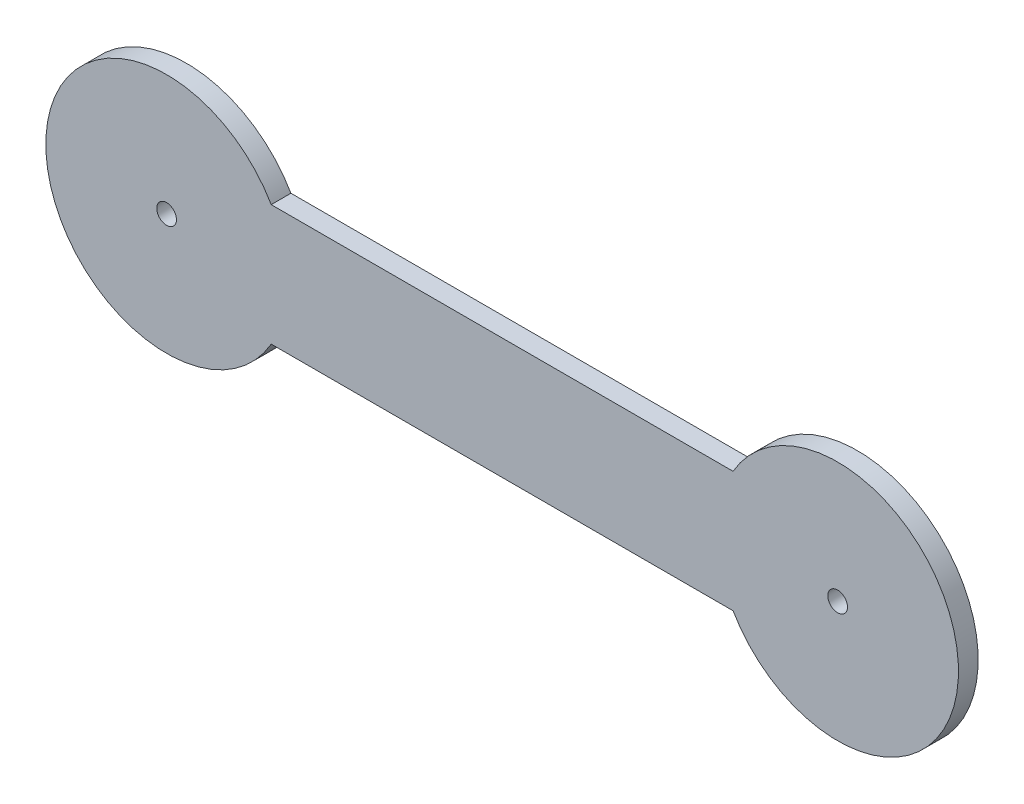
ISO-10303-21;
HEADER;
FILE_DESCRIPTION(('STEP AP214'),'2;1');
FILE_NAME('part.step','',(''),(''),'','','');
FILE_SCHEMA(('AUTOMOTIVE_DESIGN { 1 0 10303 214 1 1 1 1 }'));
ENDSEC;
DATA;
#1=APPLICATION_CONTEXT('core data for automotive mechanical design processes');
#2=APPLICATION_PROTOCOL_DEFINITION('international standard','automotive_design',2000,#1);
#3=PRODUCT_CONTEXT('',#1,'mechanical');
#4=PRODUCT('Part','Part','',(#3));
#5=PRODUCT_RELATED_PRODUCT_CATEGORY('part','',(#4));
#6=PRODUCT_DEFINITION_FORMATION('','',#4);
#7=PRODUCT_DEFINITION_CONTEXT('part definition',#1,'design');
#8=PRODUCT_DEFINITION('design','',#6,#7);
#9=PRODUCT_DEFINITION_SHAPE('','',#8);
#10=(LENGTH_UNIT() NAMED_UNIT(*) SI_UNIT(.MILLI.,.METRE.));
#11=(NAMED_UNIT(*) PLANE_ANGLE_UNIT() SI_UNIT($,.RADIAN.));
#12=(NAMED_UNIT(*) SI_UNIT($,.STERADIAN.) SOLID_ANGLE_UNIT());
#13=UNCERTAINTY_MEASURE_WITH_UNIT(LENGTH_MEASURE(1.E-05),#10,'distance_accuracy_value','');
#14=(GEOMETRIC_REPRESENTATION_CONTEXT(3) GLOBAL_UNCERTAINTY_ASSIGNED_CONTEXT((#13)) GLOBAL_UNIT_ASSIGNED_CONTEXT((#10,
#11,#12)) REPRESENTATION_CONTEXT('',''));
#15=CARTESIAN_POINT('',(0.,0.,0.));
#16=DIRECTION('',(0.,0.,1.));
#17=DIRECTION('',(1.,0.,0.));
#18=AXIS2_PLACEMENT_3D('',#15,#16,#17);
#19=CARTESIAN_POINT('',(0.,19.05,6.223));
#20=DIRECTION('',(0.,0.,-1.));
#21=DIRECTION('',(-1.,0.,0.));
#22=AXIS2_PLACEMENT_3D('',#19,#20,#21);
#23=CYLINDRICAL_SURFACE('',#22,38.1);
#24=CARTESIAN_POINT('',(0.,19.05,0.));
#25=DIRECTION('',(0.,0.,1.));
#26=DIRECTION('',(1.,0.,0.));
#27=AXIS2_PLACEMENT_3D('',#24,#25,#26);
#28=CIRCLE('',#27,38.1);
#29=CARTESIAN_POINT('',(32.9955678841871,38.1,0.));
#30=VERTEX_POINT('',#29);
#31=CARTESIAN_POINT('',(32.9955678841871,0.,0.));
#32=VERTEX_POINT('',#31);
#33=EDGE_CURVE('E104',#30,#32,#28,.T.);
#34=ORIENTED_EDGE('',*,*,#33,.T.);
#35=DIRECTION('',(0.,0.,-1.));
#36=VECTOR('',#35,1.);
#37=CARTESIAN_POINT('',(32.9955678841871,0.,6.223));
#38=LINE('',#37,#36);
#39=CARTESIAN_POINT('',(32.9955678841871,0.,6.223));
#40=VERTEX_POINT('',#39);
#41=EDGE_CURVE('E11',#40,#32,#38,.T.);
#42=ORIENTED_EDGE('',*,*,#41,.F.);
#43=CARTESIAN_POINT('',(0.,19.05,6.223));
#44=DIRECTION('',(0.,0.,1.));
#45=DIRECTION('',(1.,0.,0.));
#46=AXIS2_PLACEMENT_3D('',#43,#44,#45);
#47=CIRCLE('',#46,38.1);
#48=CARTESIAN_POINT('',(32.9955678841871,38.1,6.223));
#49=VERTEX_POINT('',#48);
#50=EDGE_CURVE('E84',#49,#40,#47,.T.);
#51=ORIENTED_EDGE('',*,*,#50,.F.);
#52=DIRECTION('',(0.,0.,-1.));
#53=VECTOR('',#52,1.);
#54=CARTESIAN_POINT('',(32.9955678841871,38.1,6.223));
#55=LINE('',#54,#53);
#56=EDGE_CURVE('E50',#49,#30,#55,.T.);
#57=ORIENTED_EDGE('',*,*,#56,.T.);
#58=EDGE_LOOP('',(#34,#42,#51,#57));
#59=FACE_BOUND('',#58,.T.);
#60=ADVANCED_FACE('F33',(#59),#23,.T.);
#61=CARTESIAN_POINT('',(105.833333333333,0.,6.223));
#62=DIRECTION('',(0.,1.,0.));
#63=DIRECTION('',(0.,0.,1.));
#64=AXIS2_PLACEMENT_3D('',#61,#62,#63);
#65=PLANE('',#64);
#66=DIRECTION('',(1.,0.,0.));
#67=VECTOR('',#66,1.);
#68=CARTESIAN_POINT('',(105.833333333333,0.,0.));
#69=LINE('',#68,#67);
#70=CARTESIAN_POINT('',(178.67109878248,0.,0.));
#71=VERTEX_POINT('',#70);
#72=EDGE_CURVE('E89',#32,#71,#69,.T.);
#73=ORIENTED_EDGE('',*,*,#72,.T.);
#74=DIRECTION('',(0.,0.,-1.));
#75=VECTOR('',#74,1.);
#76=CARTESIAN_POINT('',(178.67109878248,0.,6.223));
#77=LINE('',#76,#75);
#78=CARTESIAN_POINT('',(178.67109878248,0.,6.223));
#79=VERTEX_POINT('',#78);
#80=EDGE_CURVE('E42',#79,#71,#77,.T.);
#81=ORIENTED_EDGE('',*,*,#80,.F.);
#82=DIRECTION('',(1.,0.,0.));
#83=VECTOR('',#82,1.);
#84=CARTESIAN_POINT('',(105.833333333333,0.,6.223));
#85=LINE('',#84,#83);
#86=EDGE_CURVE('E76',#40,#79,#85,.T.);
#87=ORIENTED_EDGE('',*,*,#86,.F.);
#88=ORIENTED_EDGE('',*,*,#41,.T.);
#89=EDGE_LOOP('',(#73,#81,#87,#88));
#90=FACE_BOUND('',#89,.T.);
#91=ADVANCED_FACE('F88',(#90),#65,.F.);
#92=CARTESIAN_POINT('',(211.666666666667,19.05,6.223));
#93=DIRECTION('',(0.,0.,-1.));
#94=DIRECTION('',(-1.,0.,0.));
#95=AXIS2_PLACEMENT_3D('',#92,#93,#94);
#96=CYLINDRICAL_SURFACE('',#95,38.1);
#97=CARTESIAN_POINT('',(211.666666666667,19.05,0.));
#98=DIRECTION('',(0.,0.,1.));
#99=DIRECTION('',(1.,0.,0.));
#100=AXIS2_PLACEMENT_3D('',#97,#98,#99);
#101=CIRCLE('',#100,38.1);
#102=CARTESIAN_POINT('',(178.67109878248,38.1,0.));
#103=VERTEX_POINT('',#102);
#104=EDGE_CURVE('E107',#71,#103,#101,.T.);
#105=ORIENTED_EDGE('',*,*,#104,.T.);
#106=DIRECTION('',(0.,0.,-1.));
#107=VECTOR('',#106,1.);
#108=CARTESIAN_POINT('',(178.67109878248,38.1,6.223));
#109=LINE('',#108,#107);
#110=CARTESIAN_POINT('',(178.67109878248,38.1,6.223));
#111=VERTEX_POINT('',#110);
#112=EDGE_CURVE('E65',#111,#103,#109,.T.);
#113=ORIENTED_EDGE('',*,*,#112,.F.);
#114=CARTESIAN_POINT('',(211.666666666667,19.05,6.223));
#115=DIRECTION('',(0.,0.,1.));
#116=DIRECTION('',(1.,0.,0.));
#117=AXIS2_PLACEMENT_3D('',#114,#115,#116);
#118=CIRCLE('',#117,38.1);
#119=EDGE_CURVE('E83',#79,#111,#118,.T.);
#120=ORIENTED_EDGE('',*,*,#119,.F.);
#121=ORIENTED_EDGE('',*,*,#80,.T.);
#122=EDGE_LOOP('',(#105,#113,#120,#121));
#123=FACE_BOUND('',#122,.T.);
#124=ADVANCED_FACE('F92',(#123),#96,.T.);
#125=CARTESIAN_POINT('',(105.833333333333,38.1,6.223));
#126=DIRECTION('',(0.,1.,0.));
#127=DIRECTION('',(0.,0.,1.));
#128=AXIS2_PLACEMENT_3D('',#125,#126,#127);
#129=PLANE('',#128);
#130=DIRECTION('',(1.,0.,0.));
#131=VECTOR('',#130,1.);
#132=CARTESIAN_POINT('',(105.833333333333,38.1,0.));
#133=LINE('',#132,#131);
#134=EDGE_CURVE('E109',#30,#103,#133,.T.);
#135=ORIENTED_EDGE('',*,*,#134,.F.);
#136=ORIENTED_EDGE('',*,*,#56,.F.);
#137=DIRECTION('',(1.,0.,0.));
#138=VECTOR('',#137,1.);
#139=CARTESIAN_POINT('',(105.833333333333,38.1,6.223));
#140=LINE('',#139,#138);
#141=EDGE_CURVE('E93',#49,#111,#140,.T.);
#142=ORIENTED_EDGE('',*,*,#141,.T.);
#143=ORIENTED_EDGE('',*,*,#112,.T.);
#144=EDGE_LOOP('',(#135,#136,#142,#143));
#145=FACE_BOUND('',#144,.T.);
#146=ADVANCED_FACE('F145',(#145),#129,.T.);
#147=CARTESIAN_POINT('',(211.666666666667,19.05,6.223));
#148=DIRECTION('',(0.,0.,-1.));
#149=DIRECTION('',(-1.,0.,0.));
#150=AXIS2_PLACEMENT_3D('',#147,#148,#149);
#151=CYLINDRICAL_SURFACE('',#150,3.11149999999999);
#152=CARTESIAN_POINT('',(211.666666666667,19.05,6.223));
#153=DIRECTION('',(0.,0.,1.));
#154=DIRECTION('',(1.,0.,0.));
#155=AXIS2_PLACEMENT_3D('',#152,#153,#154);
#156=CIRCLE('',#155,3.11149999999999);
#157=CARTESIAN_POINT('',(214.778166666667,19.05,6.223));
#158=VERTEX_POINT('',#157);
#159=EDGE_CURVE('E115',#158,#158,#156,.T.);
#160=ORIENTED_EDGE('',*,*,#159,.T.);
#161=EDGE_LOOP('',(#160));
#162=FACE_BOUND('',#161,.T.);
#163=CARTESIAN_POINT('',(211.666666666667,19.05,0.));
#164=DIRECTION('',(0.,0.,1.));
#165=DIRECTION('',(1.,0.,0.));
#166=AXIS2_PLACEMENT_3D('',#163,#164,#165);
#167=CIRCLE('',#166,3.11149999999999);
#168=CARTESIAN_POINT('',(214.778166666667,19.05,0.));
#169=VERTEX_POINT('',#168);
#170=EDGE_CURVE('E101',#169,#169,#167,.T.);
#171=ORIENTED_EDGE('',*,*,#170,.F.);
#172=EDGE_LOOP('',(#171));
#173=FACE_BOUND('',#172,.T.);
#174=ADVANCED_FACE('F35',(#162,#173),#151,.F.);
#175=CARTESIAN_POINT('',(0.,19.05,6.223));
#176=DIRECTION('',(0.,0.,-1.));
#177=DIRECTION('',(-1.,0.,0.));
#178=AXIS2_PLACEMENT_3D('',#175,#176,#177);
#179=CYLINDRICAL_SURFACE('',#178,3.1115);
#180=CARTESIAN_POINT('',(0.,19.05,6.223));
#181=DIRECTION('',(0.,0.,1.));
#182=DIRECTION('',(1.,0.,0.));
#183=AXIS2_PLACEMENT_3D('',#180,#181,#182);
#184=CIRCLE('',#183,3.1115);
#185=CARTESIAN_POINT('',(3.1115,19.05,6.223));
#186=VERTEX_POINT('',#185);
#187=EDGE_CURVE('E95',#186,#186,#184,.T.);
#188=ORIENTED_EDGE('',*,*,#187,.T.);
#189=EDGE_LOOP('',(#188));
#190=FACE_BOUND('',#189,.T.);
#191=CARTESIAN_POINT('',(0.,19.05,0.));
#192=DIRECTION('',(0.,0.,1.));
#193=DIRECTION('',(1.,0.,0.));
#194=AXIS2_PLACEMENT_3D('',#191,#192,#193);
#195=CIRCLE('',#194,3.1115);
#196=CARTESIAN_POINT('',(3.1115,19.05,0.));
#197=VERTEX_POINT('',#196);
#198=EDGE_CURVE('E112',#197,#197,#195,.T.);
#199=ORIENTED_EDGE('',*,*,#198,.F.);
#200=EDGE_LOOP('',(#199));
#201=FACE_BOUND('',#200,.T.);
#202=ADVANCED_FACE('F127',(#190,#201),#179,.F.);
#203=CARTESIAN_POINT('',(105.833333333333,-212.710856973276,6.223));
#204=DIRECTION('',(0.,0.,1.));
#205=DIRECTION('',(1.,0.,0.));
#206=AXIS2_PLACEMENT_3D('',#203,#204,#205);
#207=PLANE('',#206);
#208=ORIENTED_EDGE('',*,*,#159,.F.);
#209=EDGE_LOOP('',(#208));
#210=FACE_BOUND('',#209,.T.);
#211=ORIENTED_EDGE('',*,*,#50,.T.);
#212=ORIENTED_EDGE('',*,*,#86,.T.);
#213=ORIENTED_EDGE('',*,*,#119,.T.);
#214=ORIENTED_EDGE('',*,*,#141,.F.);
#215=EDGE_LOOP('',(#211,#212,#213,#214));
#216=FACE_BOUND('',#215,.T.);
#217=ORIENTED_EDGE('',*,*,#187,.F.);
#218=EDGE_LOOP('',(#217));
#219=FACE_BOUND('',#218,.T.);
#220=ADVANCED_FACE('F79',(#210,#216,#219),#207,.T.);
#221=CARTESIAN_POINT('',(105.833333333333,-212.710856973276,0.));
#222=DIRECTION('',(0.,0.,1.));
#223=DIRECTION('',(1.,0.,0.));
#224=AXIS2_PLACEMENT_3D('',#221,#222,#223);
#225=PLANE('',#224);
#226=ORIENTED_EDGE('',*,*,#170,.T.);
#227=EDGE_LOOP('',(#226));
#228=FACE_BOUND('',#227,.T.);
#229=ORIENTED_EDGE('',*,*,#33,.F.);
#230=ORIENTED_EDGE('',*,*,#134,.T.);
#231=ORIENTED_EDGE('',*,*,#104,.F.);
#232=ORIENTED_EDGE('',*,*,#72,.F.);
#233=EDGE_LOOP('',(#229,#230,#231,#232));
#234=FACE_BOUND('',#233,.T.);
#235=ORIENTED_EDGE('',*,*,#198,.T.);
#236=EDGE_LOOP('',(#235));
#237=FACE_BOUND('',#236,.T.);
#238=ADVANCED_FACE('F126',(#228,#234,#237),#225,.F.);
#239=CLOSED_SHELL('',(#60,#91,#124,#146,#174,#202,#220,#238));
#240=MANIFOLD_SOLID_BREP('B2',#239);
#241=ADVANCED_BREP_SHAPE_REPRESENTATION('',(#18,#240),#14);
#242=SHAPE_DEFINITION_REPRESENTATION(#9,#241);
ENDSEC;
END-ISO-10303-21;
